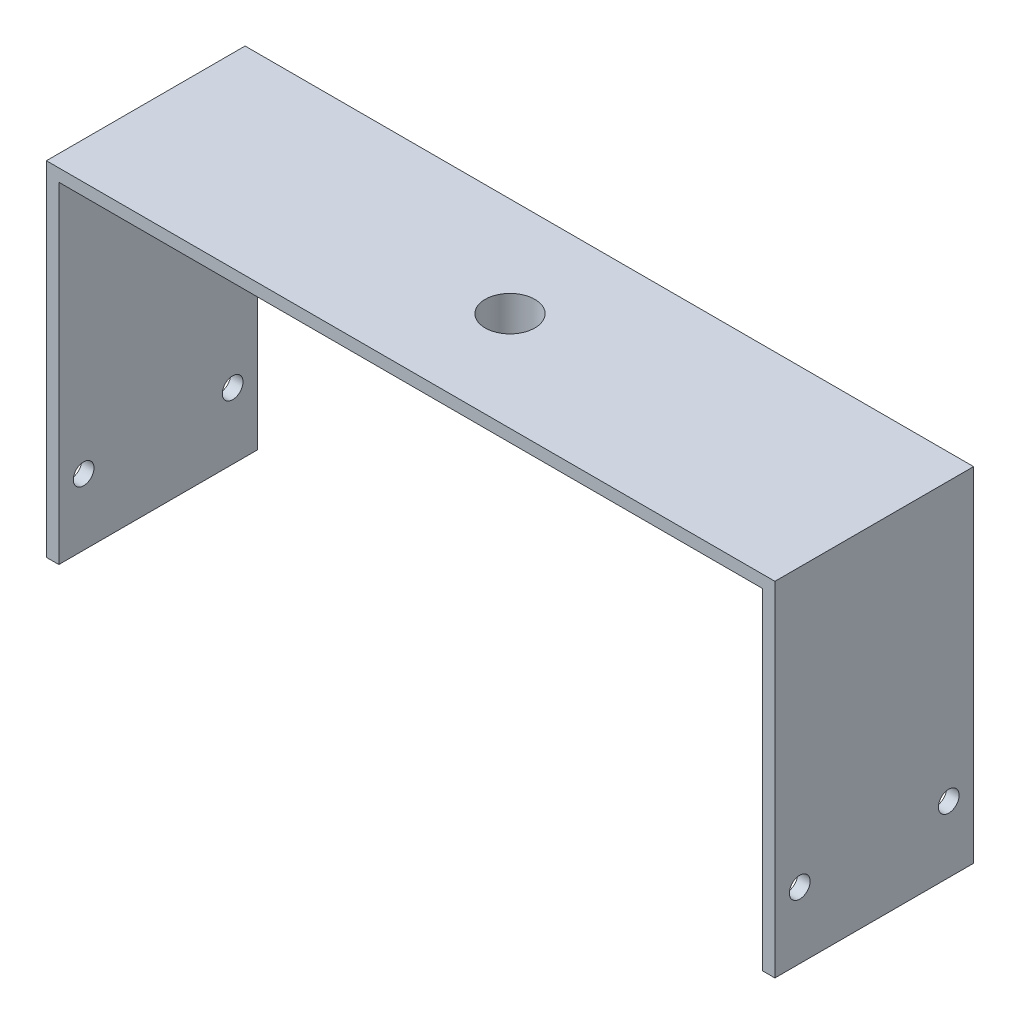
ISO-10303-21;
HEADER;
FILE_DESCRIPTION(('STEP AP214'),'2;1');
FILE_NAME('part.step','',(''),(''),'','','');
FILE_SCHEMA(('AUTOMOTIVE_DESIGN { 1 0 10303 214 1 1 1 1 }'));
ENDSEC;
DATA;
#1=APPLICATION_CONTEXT('core data for automotive mechanical design processes');
#2=APPLICATION_PROTOCOL_DEFINITION('international standard','automotive_design',2000,#1);
#3=PRODUCT_CONTEXT('',#1,'mechanical');
#4=PRODUCT('Part','Part','',(#3));
#5=PRODUCT_RELATED_PRODUCT_CATEGORY('part','',(#4));
#6=PRODUCT_DEFINITION_FORMATION('','',#4);
#7=PRODUCT_DEFINITION_CONTEXT('part definition',#1,'design');
#8=PRODUCT_DEFINITION('design','',#6,#7);
#9=PRODUCT_DEFINITION_SHAPE('','',#8);
#10=(LENGTH_UNIT() NAMED_UNIT(*) SI_UNIT(.MILLI.,.METRE.));
#11=(NAMED_UNIT(*) PLANE_ANGLE_UNIT() SI_UNIT($,.RADIAN.));
#12=(NAMED_UNIT(*) SI_UNIT($,.STERADIAN.) SOLID_ANGLE_UNIT());
#13=UNCERTAINTY_MEASURE_WITH_UNIT(LENGTH_MEASURE(1.E-05),#10,'distance_accuracy_value','');
#14=(GEOMETRIC_REPRESENTATION_CONTEXT(3) GLOBAL_UNCERTAINTY_ASSIGNED_CONTEXT((#13)) GLOBAL_UNIT_ASSIGNED_CONTEXT((#10,
#11,#12)) REPRESENTATION_CONTEXT('',''));
#15=CARTESIAN_POINT('',(0.,0.,0.));
#16=DIRECTION('',(0.,0.,1.));
#17=DIRECTION('',(1.,0.,0.));
#18=AXIS2_PLACEMENT_3D('',#15,#16,#17);
#19=CARTESIAN_POINT('',(64.1282151360602,9.59215638123489,24.));
#20=DIRECTION('',(0.,1.,0.));
#21=DIRECTION('',(-1.,0.,0.));
#22=AXIS2_PLACEMENT_3D('',#19,#20,#21);
#23=PLANE('',#22);
#24=DIRECTION('',(1.,0.,0.));
#25=VECTOR('',#24,1.);
#26=CARTESIAN_POINT('',(64.1282151360602,9.59215638123489,0.));
#27=LINE('',#26,#25);
#28=CARTESIAN_POINT('',(-20.8717848639398,9.59215638123487,0.));
#29=VERTEX_POINT('',#28);
#30=CARTESIAN_POINT('',(64.1282151360602,9.59215638123489,0.));
#31=VERTEX_POINT('',#30);
#32=EDGE_CURVE('E211',#29,#31,#27,.T.);
#33=ORIENTED_EDGE('',*,*,#32,.T.);
#34=DIRECTION('',(0.,0.,-1.));
#35=VECTOR('',#34,1.);
#36=CARTESIAN_POINT('',(64.1282151360602,9.59215638123489,24.));
#37=LINE('',#36,#35);
#38=CARTESIAN_POINT('',(64.1282151360602,9.59215638123489,24.));
#39=VERTEX_POINT('',#38);
#40=EDGE_CURVE('E231',#39,#31,#37,.T.);
#41=ORIENTED_EDGE('',*,*,#40,.F.);
#42=DIRECTION('',(1.,0.,0.));
#43=VECTOR('',#42,1.);
#44=CARTESIAN_POINT('',(64.1282151360602,9.59215638123489,24.));
#45=LINE('',#44,#43);
#46=CARTESIAN_POINT('',(-20.8717848639398,9.59215638123487,24.));
#47=VERTEX_POINT('',#46);
#48=EDGE_CURVE('E194',#47,#39,#45,.T.);
#49=ORIENTED_EDGE('',*,*,#48,.F.);
#50=DIRECTION('',(0.,0.,-1.));
#51=VECTOR('',#50,1.);
#52=CARTESIAN_POINT('',(-20.8717848639398,9.59215638123487,24.));
#53=LINE('',#52,#51);
#54=EDGE_CURVE('E234',#47,#29,#53,.T.);
#55=ORIENTED_EDGE('',*,*,#54,.T.);
#56=EDGE_LOOP('',(#33,#41,#49,#55));
#57=FACE_BOUND('',#56,.T.);
#58=DIRECTION('',(0.5,0.,-0.866025403784439));
#59=VECTOR('',#58,1.);
#60=CARTESIAN_POINT('',(15.6282151360602,9.59215638123488,12.));
#61=LINE('',#60,#59);
#62=CARTESIAN_POINT('',(15.6282151360602,9.59215638123488,12.));
#63=VERTEX_POINT('',#62);
#64=CARTESIAN_POINT('',(18.6282151360602,9.59215638123488,6.80384757729337));
#65=VERTEX_POINT('',#64);
#66=EDGE_CURVE('E157',#63,#65,#61,.T.);
#67=ORIENTED_EDGE('',*,*,#66,.F.);
#68=DIRECTION('',(-0.5,0.,-0.866025403784438));
#69=VECTOR('',#68,1.);
#70=CARTESIAN_POINT('',(18.6282151360602,9.59215638123488,17.1961524227066));
#71=LINE('',#70,#69);
#72=CARTESIAN_POINT('',(18.6282151360602,9.59215638123488,17.1961524227066));
#73=VERTEX_POINT('',#72);
#74=EDGE_CURVE('E154',#73,#63,#71,.T.);
#75=ORIENTED_EDGE('',*,*,#74,.F.);
#76=DIRECTION('',(-1.,0.,0.));
#77=VECTOR('',#76,1.);
#78=CARTESIAN_POINT('',(24.6282151360602,9.59215638123488,17.1961524227066));
#79=LINE('',#78,#77);
#80=CARTESIAN_POINT('',(24.6282151360602,9.59215638123488,17.1961524227066));
#81=VERTEX_POINT('',#80);
#82=EDGE_CURVE('E498',#81,#73,#79,.T.);
#83=ORIENTED_EDGE('',*,*,#82,.F.);
#84=DIRECTION('',(-0.5,0.,0.866025403784439));
#85=VECTOR('',#84,1.);
#86=CARTESIAN_POINT('',(27.6282151360602,9.59215638123488,12.));
#87=LINE('',#86,#85);
#88=CARTESIAN_POINT('',(27.6282151360602,9.59215638123488,12.));
#89=VERTEX_POINT('',#88);
#90=EDGE_CURVE('E513',#89,#81,#87,.T.);
#91=ORIENTED_EDGE('',*,*,#90,.F.);
#92=DIRECTION('',(0.5,0.,0.866025403784439));
#93=VECTOR('',#92,1.);
#94=CARTESIAN_POINT('',(24.6282151360602,9.59215638123488,6.80384757729337));
#95=LINE('',#94,#93);
#96=CARTESIAN_POINT('',(24.6282151360602,9.59215638123488,6.80384757729337));
#97=VERTEX_POINT('',#96);
#98=EDGE_CURVE('E55',#97,#89,#95,.T.);
#99=ORIENTED_EDGE('',*,*,#98,.F.);
#100=DIRECTION('',(1.,0.,0.));
#101=VECTOR('',#100,1.);
#102=CARTESIAN_POINT('',(18.6282151360602,9.59215638123488,6.80384757729337));
#103=LINE('',#102,#101);
#104=EDGE_CURVE('E50',#65,#97,#103,.T.);
#105=ORIENTED_EDGE('',*,*,#104,.F.);
#106=EDGE_LOOP('',(#67,#75,#83,#91,#99,#105));
#107=FACE_BOUND('',#106,.T.);
#108=ADVANCED_FACE('F33',(#57,#107),#23,.F.);
#109=CARTESIAN_POINT('',(-22.3717848639398,-30.4078436187651,24.));
#110=DIRECTION('',(1.,0.,0.));
#111=DIRECTION('',(0.,0.,-1.));
#112=AXIS2_PLACEMENT_3D('',#109,#110,#111);
#113=PLANE('',#112);
#114=CARTESIAN_POINT('',(-22.3717848639398,-22.4078436187651,3.));
#115=DIRECTION('',(-1.,0.,0.));
#116=DIRECTION('',(0.,0.,1.));
#117=AXIS2_PLACEMENT_3D('',#114,#115,#116);
#118=CIRCLE('',#117,1.25);
#119=CARTESIAN_POINT('',(-22.3717848639397,-22.4078436187651,4.25));
#120=VERTEX_POINT('',#119);
#121=EDGE_CURVE('E167',#120,#120,#118,.T.);
#122=ORIENTED_EDGE('',*,*,#121,.F.);
#123=EDGE_LOOP('',(#122));
#124=FACE_BOUND('',#123,.T.);
#125=CARTESIAN_POINT('',(-22.3717848639398,-22.4078436187651,21.));
#126=DIRECTION('',(-1.,0.,0.));
#127=DIRECTION('',(0.,0.,-1.));
#128=AXIS2_PLACEMENT_3D('',#125,#126,#127);
#129=CIRCLE('',#128,1.25);
#130=CARTESIAN_POINT('',(-22.3717848639397,-22.4078436187651,22.25));
#131=VERTEX_POINT('',#130);
#132=EDGE_CURVE('E161',#131,#131,#129,.T.);
#133=ORIENTED_EDGE('',*,*,#132,.F.);
#134=EDGE_LOOP('',(#133));
#135=FACE_BOUND('',#134,.T.);
#136=DIRECTION('',(0.,-1.,0.));
#137=VECTOR('',#136,1.);
#138=CARTESIAN_POINT('',(-22.3717848639398,-30.4078436187651,0.));
#139=LINE('',#138,#137);
#140=CARTESIAN_POINT('',(-22.3717848639398,11.0921563812349,0.));
#141=VERTEX_POINT('',#140);
#142=CARTESIAN_POINT('',(-22.3717848639398,-30.4078436187651,0.));
#143=VERTEX_POINT('',#142);
#144=EDGE_CURVE('E185',#141,#143,#139,.T.);
#145=ORIENTED_EDGE('',*,*,#144,.T.);
#146=DIRECTION('',(0.,0.,-1.));
#147=VECTOR('',#146,1.);
#148=CARTESIAN_POINT('',(-22.3717848639398,-30.4078436187651,24.));
#149=LINE('',#148,#147);
#150=CARTESIAN_POINT('',(-22.3717848639398,-30.4078436187651,24.));
#151=VERTEX_POINT('',#150);
#152=EDGE_CURVE('E11',#151,#143,#149,.T.);
#153=ORIENTED_EDGE('',*,*,#152,.F.);
#154=DIRECTION('',(0.,-1.,0.));
#155=VECTOR('',#154,1.);
#156=CARTESIAN_POINT('',(-22.3717848639398,-30.4078436187651,24.));
#157=LINE('',#156,#155);
#158=CARTESIAN_POINT('',(-22.3717848639398,11.0921563812349,24.));
#159=VERTEX_POINT('',#158);
#160=EDGE_CURVE('E186',#159,#151,#157,.T.);
#161=ORIENTED_EDGE('',*,*,#160,.F.);
#162=DIRECTION('',(0.,0.,-1.));
#163=VECTOR('',#162,1.);
#164=CARTESIAN_POINT('',(-22.3717848639398,11.0921563812349,24.));
#165=LINE('',#164,#163);
#166=EDGE_CURVE('E204',#159,#141,#165,.T.);
#167=ORIENTED_EDGE('',*,*,#166,.T.);
#168=EDGE_LOOP('',(#145,#153,#161,#167));
#169=FACE_BOUND('',#168,.T.);
#170=ADVANCED_FACE('F35',(#124,#135,#169),#113,.F.);
#171=CARTESIAN_POINT('',(-22.3717848639398,-30.4078436187651,24.));
#172=DIRECTION('',(0.,1.,0.));
#173=DIRECTION('',(0.,0.,1.));
#174=AXIS2_PLACEMENT_3D('',#171,#172,#173);
#175=PLANE('',#174);
#176=DIRECTION('',(1.,0.,0.));
#177=VECTOR('',#176,1.);
#178=CARTESIAN_POINT('',(-22.3717848639398,-30.4078436187651,0.));
#179=LINE('',#178,#177);
#180=CARTESIAN_POINT('',(-20.8717848639398,-30.4078436187651,0.));
#181=VERTEX_POINT('',#180);
#182=EDGE_CURVE('E207',#143,#181,#179,.T.);
#183=ORIENTED_EDGE('',*,*,#182,.T.);
#184=DIRECTION('',(0.,0.,-1.));
#185=VECTOR('',#184,1.);
#186=CARTESIAN_POINT('',(-20.8717848639398,-30.4078436187651,24.));
#187=LINE('',#186,#185);
#188=CARTESIAN_POINT('',(-20.8717848639398,-30.4078436187651,24.));
#189=VERTEX_POINT('',#188);
#190=EDGE_CURVE('E42',#189,#181,#187,.T.);
#191=ORIENTED_EDGE('',*,*,#190,.F.);
#192=DIRECTION('',(1.,0.,0.));
#193=VECTOR('',#192,1.);
#194=CARTESIAN_POINT('',(-22.3717848639398,-30.4078436187651,24.));
#195=LINE('',#194,#193);
#196=EDGE_CURVE('E189',#151,#189,#195,.T.);
#197=ORIENTED_EDGE('',*,*,#196,.F.);
#198=ORIENTED_EDGE('',*,*,#152,.T.);
#199=EDGE_LOOP('',(#183,#191,#197,#198));
#200=FACE_BOUND('',#199,.T.);
#201=ADVANCED_FACE('F291',(#200),#175,.F.);
#202=CARTESIAN_POINT('',(-20.8717848639398,-30.4078436187651,24.));
#203=DIRECTION('',(-1.,0.,0.));
#204=DIRECTION('',(0.,-1.,0.));
#205=AXIS2_PLACEMENT_3D('',#202,#203,#204);
#206=PLANE('',#205);
#207=CARTESIAN_POINT('',(-20.8717848639398,-22.4078436187651,3.));
#208=DIRECTION('',(-1.,0.,0.));
#209=DIRECTION('',(0.,-1.,0.));
#210=AXIS2_PLACEMENT_3D('',#207,#208,#209);
#211=CIRCLE('',#210,1.25);
#212=CARTESIAN_POINT('',(-20.8717848639397,-22.4078436187651,4.25));
#213=VERTEX_POINT('',#212);
#214=EDGE_CURVE('E182',#213,#213,#211,.T.);
#215=ORIENTED_EDGE('',*,*,#214,.T.);
#216=EDGE_LOOP('',(#215));
#217=FACE_BOUND('',#216,.T.);
#218=CARTESIAN_POINT('',(-20.8717848639398,-22.4078436187651,21.));
#219=DIRECTION('',(-1.,0.,0.));
#220=DIRECTION('',(0.,-1.,0.));
#221=AXIS2_PLACEMENT_3D('',#218,#219,#220);
#222=CIRCLE('',#221,1.25);
#223=CARTESIAN_POINT('',(-20.8717848639397,-22.4078436187651,22.25));
#224=VERTEX_POINT('',#223);
#225=EDGE_CURVE('E176',#224,#224,#222,.T.);
#226=ORIENTED_EDGE('',*,*,#225,.T.);
#227=EDGE_LOOP('',(#226));
#228=FACE_BOUND('',#227,.T.);
#229=DIRECTION('',(0.,1.,0.));
#230=VECTOR('',#229,1.);
#231=CARTESIAN_POINT('',(-20.8717848639398,-30.4078436187651,0.));
#232=LINE('',#231,#230);
#233=EDGE_CURVE('E209',#181,#29,#232,.T.);
#234=ORIENTED_EDGE('',*,*,#233,.T.);
#235=ORIENTED_EDGE('',*,*,#54,.F.);
#236=DIRECTION('',(0.,1.,0.));
#237=VECTOR('',#236,1.);
#238=CARTESIAN_POINT('',(-20.8717848639398,-30.4078436187651,24.));
#239=LINE('',#238,#237);
#240=EDGE_CURVE('E192',#189,#47,#239,.T.);
#241=ORIENTED_EDGE('',*,*,#240,.F.);
#242=ORIENTED_EDGE('',*,*,#190,.T.);
#243=EDGE_LOOP('',(#234,#235,#241,#242));
#244=FACE_BOUND('',#243,.T.);
#245=ADVANCED_FACE('F257',(#217,#228,#244),#206,.F.);
#246=CARTESIAN_POINT('',(64.1282151360602,-30.4078436187651,24.));
#247=DIRECTION('',(1.,0.,0.));
#248=DIRECTION('',(0.,0.,-1.));
#249=AXIS2_PLACEMENT_3D('',#246,#247,#248);
#250=PLANE('',#249);
#251=CARTESIAN_POINT('',(64.1282151360602,-22.4078436187651,3.));
#252=DIRECTION('',(1.,0.,0.));
#253=DIRECTION('',(0.,0.,-1.));
#254=AXIS2_PLACEMENT_3D('',#251,#252,#253);
#255=CIRCLE('',#254,1.25);
#256=CARTESIAN_POINT('',(64.1282151360602,-22.4078436187651,4.25));
#257=VERTEX_POINT('',#256);
#258=EDGE_CURVE('E179',#257,#257,#255,.T.);
#259=ORIENTED_EDGE('',*,*,#258,.T.);
#260=EDGE_LOOP('',(#259));
#261=FACE_BOUND('',#260,.T.);
#262=CARTESIAN_POINT('',(64.1282151360602,-22.4078436187651,21.));
#263=DIRECTION('',(1.,0.,0.));
#264=DIRECTION('',(0.,0.,-1.));
#265=AXIS2_PLACEMENT_3D('',#262,#263,#264);
#266=CIRCLE('',#265,1.25);
#267=CARTESIAN_POINT('',(64.1282151360602,-22.4078436187651,22.25));
#268=VERTEX_POINT('',#267);
#269=EDGE_CURVE('E173',#268,#268,#266,.T.);
#270=ORIENTED_EDGE('',*,*,#269,.T.);
#271=EDGE_LOOP('',(#270));
#272=FACE_BOUND('',#271,.T.);
#273=DIRECTION('',(0.,-1.,0.));
#274=VECTOR('',#273,1.);
#275=CARTESIAN_POINT('',(64.1282151360602,-30.4078436187651,0.));
#276=LINE('',#275,#274);
#277=CARTESIAN_POINT('',(64.1282151360602,-30.4078436187651,0.));
#278=VERTEX_POINT('',#277);
#279=EDGE_CURVE('E213',#31,#278,#276,.T.);
#280=ORIENTED_EDGE('',*,*,#279,.T.);
#281=DIRECTION('',(0.,0.,-1.));
#282=VECTOR('',#281,1.);
#283=CARTESIAN_POINT('',(64.1282151360602,-30.4078436187651,24.));
#284=LINE('',#283,#282);
#285=CARTESIAN_POINT('',(64.1282151360602,-30.4078436187651,24.));
#286=VERTEX_POINT('',#285);
#287=EDGE_CURVE('E228',#286,#278,#284,.T.);
#288=ORIENTED_EDGE('',*,*,#287,.F.);
#289=DIRECTION('',(0.,-1.,0.));
#290=VECTOR('',#289,1.);
#291=CARTESIAN_POINT('',(64.1282151360602,-30.4078436187651,24.));
#292=LINE('',#291,#290);
#293=EDGE_CURVE('E196',#39,#286,#292,.T.);
#294=ORIENTED_EDGE('',*,*,#293,.F.);
#295=ORIENTED_EDGE('',*,*,#40,.T.);
#296=EDGE_LOOP('',(#280,#288,#294,#295));
#297=FACE_BOUND('',#296,.T.);
#298=ADVANCED_FACE('F253',(#261,#272,#297),#250,.F.);
#299=CARTESIAN_POINT('',(64.1282151360602,-30.4078436187651,24.));
#300=DIRECTION('',(0.,1.,0.));
#301=DIRECTION('',(0.,0.,1.));
#302=AXIS2_PLACEMENT_3D('',#299,#300,#301);
#303=PLANE('',#302);
#304=DIRECTION('',(1.,0.,0.));
#305=VECTOR('',#304,1.);
#306=CARTESIAN_POINT('',(64.1282151360602,-30.4078436187651,0.));
#307=LINE('',#306,#305);
#308=CARTESIAN_POINT('',(65.6282151360602,-30.4078436187651,0.));
#309=VERTEX_POINT('',#308);
#310=EDGE_CURVE('E215',#278,#309,#307,.T.);
#311=ORIENTED_EDGE('',*,*,#310,.T.);
#312=DIRECTION('',(0.,0.,-1.));
#313=VECTOR('',#312,1.);
#314=CARTESIAN_POINT('',(65.6282151360602,-30.4078436187651,24.));
#315=LINE('',#314,#313);
#316=CARTESIAN_POINT('',(65.6282151360602,-30.4078436187651,24.));
#317=VERTEX_POINT('',#316);
#318=EDGE_CURVE('E225',#317,#309,#315,.T.);
#319=ORIENTED_EDGE('',*,*,#318,.F.);
#320=DIRECTION('',(1.,0.,0.));
#321=VECTOR('',#320,1.);
#322=CARTESIAN_POINT('',(64.1282151360602,-30.4078436187651,24.));
#323=LINE('',#322,#321);
#324=EDGE_CURVE('E198',#286,#317,#323,.T.);
#325=ORIENTED_EDGE('',*,*,#324,.F.);
#326=ORIENTED_EDGE('',*,*,#287,.T.);
#327=EDGE_LOOP('',(#311,#319,#325,#326));
#328=FACE_BOUND('',#327,.T.);
#329=ADVANCED_FACE('F256',(#328),#303,.F.);
#330=CARTESIAN_POINT('',(65.6282151360602,-30.4078436187651,24.));
#331=DIRECTION('',(-1.,0.,0.));
#332=DIRECTION('',(0.,0.,1.));
#333=AXIS2_PLACEMENT_3D('',#330,#331,#332);
#334=PLANE('',#333);
#335=CARTESIAN_POINT('',(65.6282151360602,-22.4078436187651,3.));
#336=DIRECTION('',(-1.,0.,0.));
#337=DIRECTION('',(0.,0.,1.));
#338=AXIS2_PLACEMENT_3D('',#335,#336,#337);
#339=CIRCLE('',#338,1.25);
#340=CARTESIAN_POINT('',(65.6282151360602,-22.4078436187651,4.25));
#341=VERTEX_POINT('',#340);
#342=EDGE_CURVE('E37',#341,#341,#339,.T.);
#343=ORIENTED_EDGE('',*,*,#342,.T.);
#344=EDGE_LOOP('',(#343));
#345=FACE_BOUND('',#344,.T.);
#346=CARTESIAN_POINT('',(65.6282151360602,-22.4078436187651,21.));
#347=DIRECTION('',(-1.,0.,0.));
#348=DIRECTION('',(0.,0.,1.));
#349=AXIS2_PLACEMENT_3D('',#346,#347,#348);
#350=CIRCLE('',#349,1.25);
#351=CARTESIAN_POINT('',(65.6282151360602,-22.4078436187651,22.25));
#352=VERTEX_POINT('',#351);
#353=EDGE_CURVE('E170',#352,#352,#350,.T.);
#354=ORIENTED_EDGE('',*,*,#353,.T.);
#355=EDGE_LOOP('',(#354));
#356=FACE_BOUND('',#355,.T.);
#357=DIRECTION('',(0.,1.,0.));
#358=VECTOR('',#357,1.);
#359=CARTESIAN_POINT('',(65.6282151360602,-30.4078436187651,0.));
#360=LINE('',#359,#358);
#361=CARTESIAN_POINT('',(65.6282151360602,11.0921563812349,0.));
#362=VERTEX_POINT('',#361);
#363=EDGE_CURVE('E217',#309,#362,#360,.T.);
#364=ORIENTED_EDGE('',*,*,#363,.T.);
#365=DIRECTION('',(0.,0.,-1.));
#366=VECTOR('',#365,1.);
#367=CARTESIAN_POINT('',(65.6282151360602,11.0921563812349,24.));
#368=LINE('',#367,#366);
#369=CARTESIAN_POINT('',(65.6282151360602,11.0921563812349,24.));
#370=VERTEX_POINT('',#369);
#371=EDGE_CURVE('E222',#370,#362,#368,.T.);
#372=ORIENTED_EDGE('',*,*,#371,.F.);
#373=DIRECTION('',(0.,1.,0.));
#374=VECTOR('',#373,1.);
#375=CARTESIAN_POINT('',(65.6282151360602,-30.4078436187651,24.));
#376=LINE('',#375,#374);
#377=EDGE_CURVE('E200',#317,#370,#376,.T.);
#378=ORIENTED_EDGE('',*,*,#377,.F.);
#379=ORIENTED_EDGE('',*,*,#318,.T.);
#380=EDGE_LOOP('',(#364,#372,#378,#379));
#381=FACE_BOUND('',#380,.T.);
#382=ADVANCED_FACE('F241',(#345,#356,#381),#334,.F.);
#383=CARTESIAN_POINT('',(65.6282151360602,11.0921563812349,24.));
#384=DIRECTION('',(0.,-1.,0.));
#385=DIRECTION('',(1.,0.,0.));
#386=AXIS2_PLACEMENT_3D('',#383,#384,#385);
#387=PLANE('',#386);
#388=CARTESIAN_POINT('',(21.6282151360602,11.0921563812349,12.));
#389=DIRECTION('',(0.,1.,0.));
#390=DIRECTION('',(-1.,0.,0.));
#391=AXIS2_PLACEMENT_3D('',#388,#389,#390);
#392=CIRCLE('',#391,3.);
#393=CARTESIAN_POINT('',(18.6282151360602,11.0921563812349,12.));
#394=VERTEX_POINT('',#393);
#395=EDGE_CURVE('E158',#394,#394,#392,.T.);
#396=ORIENTED_EDGE('',*,*,#395,.F.);
#397=EDGE_LOOP('',(#396));
#398=FACE_BOUND('',#397,.T.);
#399=DIRECTION('',(-1.,0.,0.));
#400=VECTOR('',#399,1.);
#401=CARTESIAN_POINT('',(65.6282151360602,11.0921563812349,0.));
#402=LINE('',#401,#400);
#403=EDGE_CURVE('E190',#362,#141,#402,.T.);
#404=ORIENTED_EDGE('',*,*,#403,.T.);
#405=ORIENTED_EDGE('',*,*,#166,.F.);
#406=DIRECTION('',(-1.,0.,0.));
#407=VECTOR('',#406,1.);
#408=CARTESIAN_POINT('',(65.6282151360602,11.0921563812349,24.));
#409=LINE('',#408,#407);
#410=EDGE_CURVE('E202',#370,#159,#409,.T.);
#411=ORIENTED_EDGE('',*,*,#410,.F.);
#412=ORIENTED_EDGE('',*,*,#371,.T.);
#413=EDGE_LOOP('',(#404,#405,#411,#412));
#414=FACE_BOUND('',#413,.T.);
#415=ADVANCED_FACE('F277',(#398,#414),#387,.F.);
#416=CARTESIAN_POINT('',(0.,0.,24.));
#417=DIRECTION('',(0.,0.,1.));
#418=DIRECTION('',(1.,0.,0.));
#419=AXIS2_PLACEMENT_3D('',#416,#417,#418);
#420=PLANE('',#419);
#421=ORIENTED_EDGE('',*,*,#160,.T.);
#422=ORIENTED_EDGE('',*,*,#196,.T.);
#423=ORIENTED_EDGE('',*,*,#240,.T.);
#424=ORIENTED_EDGE('',*,*,#48,.T.);
#425=ORIENTED_EDGE('',*,*,#293,.T.);
#426=ORIENTED_EDGE('',*,*,#324,.T.);
#427=ORIENTED_EDGE('',*,*,#377,.T.);
#428=ORIENTED_EDGE('',*,*,#410,.T.);
#429=EDGE_LOOP('',(#421,#422,#423,#424,#425,#426,#427,#428));
#430=FACE_BOUND('',#429,.T.);
#431=ADVANCED_FACE('F281',(#430),#420,.T.);
#432=CARTESIAN_POINT('',(0.,0.,0.));
#433=DIRECTION('',(0.,0.,1.));
#434=DIRECTION('',(1.,0.,0.));
#435=AXIS2_PLACEMENT_3D('',#432,#433,#434);
#436=PLANE('',#435);
#437=ORIENTED_EDGE('',*,*,#144,.F.);
#438=ORIENTED_EDGE('',*,*,#403,.F.);
#439=ORIENTED_EDGE('',*,*,#363,.F.);
#440=ORIENTED_EDGE('',*,*,#310,.F.);
#441=ORIENTED_EDGE('',*,*,#279,.F.);
#442=ORIENTED_EDGE('',*,*,#32,.F.);
#443=ORIENTED_EDGE('',*,*,#233,.F.);
#444=ORIENTED_EDGE('',*,*,#182,.F.);
#445=EDGE_LOOP('',(#437,#438,#439,#440,#441,#442,#443,#444));
#446=FACE_BOUND('',#445,.T.);
#447=ADVANCED_FACE('F248',(#446),#436,.F.);
#448=CARTESIAN_POINT('',(67.6282151360602,-22.4078436187651,21.));
#449=DIRECTION('',(-1.,0.,0.));
#450=DIRECTION('',(0.,0.,1.));
#451=AXIS2_PLACEMENT_3D('',#448,#449,#450);
#452=CYLINDRICAL_SURFACE('',#451,1.25);
#453=CARTESIAN_POINT('',(65.6282151360602,-22.4078436187651,22.25));
#454=CARTESIAN_POINT('',(65.6125901360602,-22.4078436187651,22.25));
#455=CARTESIAN_POINT('',(65.5969651360602,-22.4078436187651,22.25));
#456=CARTESIAN_POINT('',(65.5657151360602,-22.4078436187651,22.25));
#457=CARTESIAN_POINT('',(65.5500901360602,-22.4078436187651,22.25));
#458=CARTESIAN_POINT('',(65.5188401360602,-22.4078436187651,22.25));
#459=CARTESIAN_POINT('',(65.5032151360602,-22.4078436187651,22.25));
#460=CARTESIAN_POINT('',(65.4719651360602,-22.4078436187651,22.25));
#461=CARTESIAN_POINT('',(65.4563401360602,-22.4078436187651,22.25));
#462=CARTESIAN_POINT('',(65.4250901360602,-22.4078436187651,22.25));
#463=CARTESIAN_POINT('',(65.4094651360602,-22.4078436187651,22.25));
#464=CARTESIAN_POINT('',(65.3782151360602,-22.4078436187651,22.25));
#465=CARTESIAN_POINT('',(65.3625901360602,-22.4078436187651,22.25));
#466=CARTESIAN_POINT('',(65.3313401360602,-22.4078436187651,22.25));
#467=CARTESIAN_POINT('',(65.3157151360602,-22.4078436187651,22.25));
#468=CARTESIAN_POINT('',(65.2844651360602,-22.4078436187651,22.25));
#469=CARTESIAN_POINT('',(65.2688401360602,-22.4078436187651,22.25));
#470=CARTESIAN_POINT('',(65.2375901360602,-22.4078436187651,22.25));
#471=CARTESIAN_POINT('',(65.2219651360602,-22.4078436187651,22.25));
#472=CARTESIAN_POINT('',(65.1907151360602,-22.4078436187651,22.25));
#473=CARTESIAN_POINT('',(65.1750901360602,-22.4078436187651,22.25));
#474=CARTESIAN_POINT('',(65.1438401360602,-22.4078436187651,22.25));
#475=CARTESIAN_POINT('',(65.1282151360602,-22.4078436187651,22.25));
#476=CARTESIAN_POINT('',(65.0969651360602,-22.4078436187651,22.25));
#477=CARTESIAN_POINT('',(65.0813401360602,-22.4078436187651,22.25));
#478=CARTESIAN_POINT('',(65.0500901360602,-22.4078436187651,22.25));
#479=CARTESIAN_POINT('',(65.0344651360602,-22.4078436187651,22.25));
#480=CARTESIAN_POINT('',(65.0032151360602,-22.4078436187651,22.25));
#481=CARTESIAN_POINT('',(64.9875901360602,-22.4078436187651,22.25));
#482=CARTESIAN_POINT('',(64.9563401360602,-22.4078436187651,22.25));
#483=CARTESIAN_POINT('',(64.9407151360602,-22.4078436187651,22.25));
#484=CARTESIAN_POINT('',(64.9094651360602,-22.4078436187651,22.25));
#485=CARTESIAN_POINT('',(64.8938401360602,-22.4078436187651,22.25));
#486=CARTESIAN_POINT('',(64.8625901360602,-22.4078436187651,22.25));
#487=CARTESIAN_POINT('',(64.8469651360602,-22.4078436187651,22.25));
#488=CARTESIAN_POINT('',(64.8157151360602,-22.4078436187651,22.25));
#489=CARTESIAN_POINT('',(64.8000901360602,-22.4078436187651,22.25));
#490=CARTESIAN_POINT('',(64.7688401360602,-22.4078436187651,22.25));
#491=CARTESIAN_POINT('',(64.7532151360602,-22.4078436187651,22.25));
#492=CARTESIAN_POINT('',(64.7219651360602,-22.4078436187651,22.25));
#493=CARTESIAN_POINT('',(64.7063401360602,-22.4078436187651,22.25));
#494=CARTESIAN_POINT('',(64.6750901360602,-22.4078436187651,22.25));
#495=CARTESIAN_POINT('',(64.6594651360602,-22.4078436187651,22.25));
#496=CARTESIAN_POINT('',(64.6282151360602,-22.4078436187651,22.25));
#497=CARTESIAN_POINT('',(64.6125901360602,-22.4078436187651,22.25));
#498=CARTESIAN_POINT('',(64.5813401360602,-22.4078436187651,22.25));
#499=CARTESIAN_POINT('',(64.5657151360602,-22.4078436187651,22.25));
#500=CARTESIAN_POINT('',(64.5344651360602,-22.4078436187651,22.25));
#501=CARTESIAN_POINT('',(64.5188401360602,-22.4078436187651,22.25));
#502=CARTESIAN_POINT('',(64.4875901360602,-22.4078436187651,22.25));
#503=CARTESIAN_POINT('',(64.4719651360602,-22.4078436187651,22.25));
#504=CARTESIAN_POINT('',(64.4407151360602,-22.4078436187651,22.25));
#505=CARTESIAN_POINT('',(64.4250901360602,-22.4078436187651,22.25));
#506=CARTESIAN_POINT('',(64.3938401360602,-22.4078436187651,22.25));
#507=CARTESIAN_POINT('',(64.3782151360602,-22.4078436187651,22.25));
#508=CARTESIAN_POINT('',(64.3469651360602,-22.4078436187651,22.25));
#509=CARTESIAN_POINT('',(64.3313401360602,-22.4078436187651,22.25));
#510=CARTESIAN_POINT('',(64.3000901360602,-22.4078436187651,22.25));
#511=CARTESIAN_POINT('',(64.2844651360602,-22.4078436187651,22.25));
#512=CARTESIAN_POINT('',(64.2532151360602,-22.4078436187651,22.25));
#513=CARTESIAN_POINT('',(64.2375901360602,-22.4078436187651,22.25));
#514=CARTESIAN_POINT('',(64.2063401360602,-22.4078436187651,22.25));
#515=CARTESIAN_POINT('',(64.1907151360602,-22.4078436187651,22.25));
#516=CARTESIAN_POINT('',(64.1594651360602,-22.4078436187651,22.25));
#517=CARTESIAN_POINT('',(64.1438401360602,-22.4078436187651,22.25));
#518=CARTESIAN_POINT('',(64.1282151360602,-22.4078436187651,22.25));
#519=B_SPLINE_CURVE_WITH_KNOTS('',3,(#453,#454,#455,#456,#457,#458,#459,#460,#461,#462,#463,
#464,#465,#466,#467,#468,#469,#470,#471,#472,#473,#474,#475,#476,#477,#478,#479,#480,#481,#482,
#483,#484,#485,#486,#487,#488,#489,#490,#491,#492,#493,#494,#495,#496,#497,#498,#499,#500,#501,
#502,#503,#504,#505,#506,#507,#508,#509,#510,#511,#512,#513,#514,#515,#516,#517,#518),
.UNSPECIFIED.,.F.,.F.,(4,2,2,2,2,2,2,2,2,2,2,2,2,2,2,2,2,2,2,2,2,2,2,2,2,2,2,2,2,2,2,2,4),(0.,
0.0468750000000018,0.0937500000000036,0.140625000000005,0.187500000000007,0.234375000000009,
0.281250000000011,0.328125000000012,0.375,0.421875000000002,0.468750000000004,0.515625000000006,
0.562500000000007,0.609375000000009,0.656250000000011,0.703125000000013,0.750000000000001,
0.796875000000002,0.843750000000004,0.890625000000006,0.937500000000008,0.98437500000001,
1.03125000000001,1.07812500000001,1.125,1.171875,1.21875,1.26562500000001,1.31250000000001,
1.35937500000001,1.40625000000001,1.45312500000001,1.5),.UNSPECIFIED.);
#520=EDGE_CURVE('BSEAM244',#352,#268,#519,.T.);
#521=ORIENTED_EDGE('',*,*,#353,.F.);
#522=ORIENTED_EDGE('',*,*,#269,.F.);
#523=ORIENTED_EDGE('',*,*,#520,.T.);
#524=ORIENTED_EDGE('',*,*,#520,.F.);
#525=EDGE_LOOP('',(#521,#523,#522,#524));
#526=FACE_BOUND('',#525,.T.);
#527=ADVANCED_FACE('F244',(#526),#452,.F.);
#528=CARTESIAN_POINT('',(67.6282151360602,-22.4078436187651,3.));
#529=DIRECTION('',(-1.,0.,0.));
#530=DIRECTION('',(0.,0.,1.));
#531=AXIS2_PLACEMENT_3D('',#528,#529,#530);
#532=CYLINDRICAL_SURFACE('',#531,1.25);
#533=CARTESIAN_POINT('',(65.6282151360602,-22.4078436187651,4.25));
#534=CARTESIAN_POINT('',(65.6125901360602,-22.4078436187651,4.25));
#535=CARTESIAN_POINT('',(65.5969651360602,-22.4078436187651,4.25));
#536=CARTESIAN_POINT('',(65.5657151360602,-22.4078436187651,4.25));
#537=CARTESIAN_POINT('',(65.5500901360602,-22.4078436187651,4.25));
#538=CARTESIAN_POINT('',(65.5188401360602,-22.4078436187651,4.25));
#539=CARTESIAN_POINT('',(65.5032151360602,-22.4078436187651,4.25));
#540=CARTESIAN_POINT('',(65.4719651360602,-22.4078436187651,4.25));
#541=CARTESIAN_POINT('',(65.4563401360602,-22.4078436187651,4.25));
#542=CARTESIAN_POINT('',(65.4250901360602,-22.4078436187651,4.25));
#543=CARTESIAN_POINT('',(65.4094651360602,-22.4078436187651,4.25));
#544=CARTESIAN_POINT('',(65.3782151360602,-22.4078436187651,4.25));
#545=CARTESIAN_POINT('',(65.3625901360602,-22.4078436187651,4.25));
#546=CARTESIAN_POINT('',(65.3313401360602,-22.4078436187651,4.25));
#547=CARTESIAN_POINT('',(65.3157151360602,-22.4078436187651,4.25));
#548=CARTESIAN_POINT('',(65.2844651360602,-22.4078436187651,4.25));
#549=CARTESIAN_POINT('',(65.2688401360602,-22.4078436187651,4.25));
#550=CARTESIAN_POINT('',(65.2375901360602,-22.4078436187651,4.25));
#551=CARTESIAN_POINT('',(65.2219651360602,-22.4078436187651,4.25));
#552=CARTESIAN_POINT('',(65.1907151360602,-22.4078436187651,4.25));
#553=CARTESIAN_POINT('',(65.1750901360602,-22.4078436187651,4.25));
#554=CARTESIAN_POINT('',(65.1438401360602,-22.4078436187651,4.25));
#555=CARTESIAN_POINT('',(65.1282151360602,-22.4078436187651,4.25));
#556=CARTESIAN_POINT('',(65.0969651360602,-22.4078436187651,4.25));
#557=CARTESIAN_POINT('',(65.0813401360602,-22.4078436187651,4.25));
#558=CARTESIAN_POINT('',(65.0500901360602,-22.4078436187651,4.25));
#559=CARTESIAN_POINT('',(65.0344651360602,-22.4078436187651,4.25));
#560=CARTESIAN_POINT('',(65.0032151360602,-22.4078436187651,4.25));
#561=CARTESIAN_POINT('',(64.9875901360602,-22.4078436187651,4.25));
#562=CARTESIAN_POINT('',(64.9563401360602,-22.4078436187651,4.25));
#563=CARTESIAN_POINT('',(64.9407151360602,-22.4078436187651,4.25));
#564=CARTESIAN_POINT('',(64.9094651360602,-22.4078436187651,4.25));
#565=CARTESIAN_POINT('',(64.8938401360602,-22.4078436187651,4.25));
#566=CARTESIAN_POINT('',(64.8625901360602,-22.4078436187651,4.25));
#567=CARTESIAN_POINT('',(64.8469651360602,-22.4078436187651,4.25));
#568=CARTESIAN_POINT('',(64.8157151360602,-22.4078436187651,4.25));
#569=CARTESIAN_POINT('',(64.8000901360602,-22.4078436187651,4.25));
#570=CARTESIAN_POINT('',(64.7688401360602,-22.4078436187651,4.25));
#571=CARTESIAN_POINT('',(64.7532151360602,-22.4078436187651,4.25));
#572=CARTESIAN_POINT('',(64.7219651360602,-22.4078436187651,4.25));
#573=CARTESIAN_POINT('',(64.7063401360602,-22.4078436187651,4.25));
#574=CARTESIAN_POINT('',(64.6750901360602,-22.4078436187651,4.25));
#575=CARTESIAN_POINT('',(64.6594651360602,-22.4078436187651,4.25));
#576=CARTESIAN_POINT('',(64.6282151360602,-22.4078436187651,4.25));
#577=CARTESIAN_POINT('',(64.6125901360602,-22.4078436187651,4.25));
#578=CARTESIAN_POINT('',(64.5813401360602,-22.4078436187651,4.25));
#579=CARTESIAN_POINT('',(64.5657151360602,-22.4078436187651,4.25));
#580=CARTESIAN_POINT('',(64.5344651360602,-22.4078436187651,4.25));
#581=CARTESIAN_POINT('',(64.5188401360602,-22.4078436187651,4.25));
#582=CARTESIAN_POINT('',(64.4875901360602,-22.4078436187651,4.25));
#583=CARTESIAN_POINT('',(64.4719651360602,-22.4078436187651,4.25));
#584=CARTESIAN_POINT('',(64.4407151360602,-22.4078436187651,4.25));
#585=CARTESIAN_POINT('',(64.4250901360602,-22.4078436187651,4.25));
#586=CARTESIAN_POINT('',(64.3938401360602,-22.4078436187651,4.25));
#587=CARTESIAN_POINT('',(64.3782151360602,-22.4078436187651,4.25));
#588=CARTESIAN_POINT('',(64.3469651360602,-22.4078436187651,4.25));
#589=CARTESIAN_POINT('',(64.3313401360602,-22.4078436187651,4.25));
#590=CARTESIAN_POINT('',(64.3000901360602,-22.4078436187651,4.25));
#591=CARTESIAN_POINT('',(64.2844651360602,-22.4078436187651,4.25));
#592=CARTESIAN_POINT('',(64.2532151360602,-22.4078436187651,4.25));
#593=CARTESIAN_POINT('',(64.2375901360602,-22.4078436187651,4.25));
#594=CARTESIAN_POINT('',(64.2063401360602,-22.4078436187651,4.25));
#595=CARTESIAN_POINT('',(64.1907151360602,-22.4078436187651,4.25));
#596=CARTESIAN_POINT('',(64.1594651360602,-22.4078436187651,4.25));
#597=CARTESIAN_POINT('',(64.1438401360602,-22.4078436187651,4.25));
#598=CARTESIAN_POINT('',(64.1282151360602,-22.4078436187651,4.25));
#599=B_SPLINE_CURVE_WITH_KNOTS('',3,(#533,#534,#535,#536,#537,#538,#539,#540,#541,#542,#543,
#544,#545,#546,#547,#548,#549,#550,#551,#552,#553,#554,#555,#556,#557,#558,#559,#560,#561,#562,
#563,#564,#565,#566,#567,#568,#569,#570,#571,#572,#573,#574,#575,#576,#577,#578,#579,#580,#581,
#582,#583,#584,#585,#586,#587,#588,#589,#590,#591,#592,#593,#594,#595,#596,#597,#598),
.UNSPECIFIED.,.F.,.F.,(4,2,2,2,2,2,2,2,2,2,2,2,2,2,2,2,2,2,2,2,2,2,2,2,2,2,2,2,2,2,2,2,4),(0.,
0.0468750000000018,0.0937500000000036,0.140625000000005,0.187500000000007,0.234375000000009,
0.281250000000011,0.328125000000012,0.375,0.421875000000002,0.468750000000004,0.515625000000006,
0.562500000000007,0.609375000000009,0.656250000000011,0.703125000000013,0.750000000000001,
0.796875000000002,0.843750000000004,0.890625000000006,0.937500000000008,0.98437500000001,
1.03125000000001,1.07812500000001,1.125,1.171875,1.21875,1.26562500000001,1.31250000000001,
1.35937500000001,1.40625000000001,1.45312500000001,1.5),.UNSPECIFIED.);
#600=EDGE_CURVE('BSEAM247',#341,#257,#599,.T.);
#601=ORIENTED_EDGE('',*,*,#342,.F.);
#602=ORIENTED_EDGE('',*,*,#258,.F.);
#603=ORIENTED_EDGE('',*,*,#600,.T.);
#604=ORIENTED_EDGE('',*,*,#600,.F.);
#605=EDGE_LOOP('',(#601,#603,#602,#604));
#606=FACE_BOUND('',#605,.T.);
#607=ADVANCED_FACE('F247',(#606),#532,.F.);
#608=CARTESIAN_POINT('',(-22.3717848639397,-22.4078436187651,22.25));
#609=CARTESIAN_POINT('',(-22.3561598639397,-22.4078436187651,22.25));
#610=CARTESIAN_POINT('',(-22.3405348639397,-22.4078436187651,22.25));
#611=CARTESIAN_POINT('',(-22.3092848639397,-22.4078436187651,22.25));
#612=CARTESIAN_POINT('',(-22.2936598639397,-22.4078436187651,22.25));
#613=CARTESIAN_POINT('',(-22.2624098639397,-22.4078436187651,22.25));
#614=CARTESIAN_POINT('',(-22.2467848639397,-22.4078436187651,22.25));
#615=CARTESIAN_POINT('',(-22.2155348639397,-22.4078436187651,22.25));
#616=CARTESIAN_POINT('',(-22.1999098639397,-22.4078436187651,22.25));
#617=CARTESIAN_POINT('',(-22.1686598639397,-22.4078436187651,22.25));
#618=CARTESIAN_POINT('',(-22.1530348639397,-22.4078436187651,22.25));
#619=CARTESIAN_POINT('',(-22.1217848639397,-22.4078436187651,22.25));
#620=CARTESIAN_POINT('',(-22.1061598639397,-22.4078436187651,22.25));
#621=CARTESIAN_POINT('',(-22.0749098639397,-22.4078436187651,22.25));
#622=CARTESIAN_POINT('',(-22.0592848639397,-22.4078436187651,22.25));
#623=CARTESIAN_POINT('',(-22.0280348639397,-22.4078436187651,22.25));
#624=CARTESIAN_POINT('',(-22.0124098639397,-22.4078436187651,22.25));
#625=CARTESIAN_POINT('',(-21.9811598639397,-22.4078436187651,22.25));
#626=CARTESIAN_POINT('',(-21.9655348639397,-22.4078436187651,22.25));
#627=CARTESIAN_POINT('',(-21.9342848639397,-22.4078436187651,22.25));
#628=CARTESIAN_POINT('',(-21.9186598639397,-22.4078436187651,22.25));
#629=CARTESIAN_POINT('',(-21.8874098639397,-22.4078436187651,22.25));
#630=CARTESIAN_POINT('',(-21.8717848639397,-22.4078436187651,22.25));
#631=CARTESIAN_POINT('',(-21.8405348639397,-22.4078436187651,22.25));
#632=CARTESIAN_POINT('',(-21.8249098639397,-22.4078436187651,22.25));
#633=CARTESIAN_POINT('',(-21.7936598639397,-22.4078436187651,22.25));
#634=CARTESIAN_POINT('',(-21.7780348639398,-22.4078436187651,22.25));
#635=CARTESIAN_POINT('',(-21.7467848639397,-22.4078436187651,22.25));
#636=CARTESIAN_POINT('',(-21.7311598639397,-22.4078436187651,22.25));
#637=CARTESIAN_POINT('',(-21.6999098639397,-22.4078436187651,22.25));
#638=CARTESIAN_POINT('',(-21.6842848639397,-22.4078436187651,22.25));
#639=CARTESIAN_POINT('',(-21.6530348639397,-22.4078436187651,22.25));
#640=CARTESIAN_POINT('',(-21.6374098639397,-22.4078436187651,22.25));
#641=CARTESIAN_POINT('',(-21.6061598639397,-22.4078436187651,22.25));
#642=CARTESIAN_POINT('',(-21.5905348639397,-22.4078436187651,22.25));
#643=CARTESIAN_POINT('',(-21.5592848639397,-22.4078436187651,22.25));
#644=CARTESIAN_POINT('',(-21.5436598639397,-22.4078436187651,22.25));
#645=CARTESIAN_POINT('',(-21.5124098639397,-22.4078436187651,22.25));
#646=CARTESIAN_POINT('',(-21.4967848639397,-22.4078436187651,22.25));
#647=CARTESIAN_POINT('',(-21.4655348639397,-22.4078436187651,22.25));
#648=CARTESIAN_POINT('',(-21.4499098639397,-22.4078436187651,22.25));
#649=CARTESIAN_POINT('',(-21.4186598639397,-22.4078436187651,22.25));
#650=CARTESIAN_POINT('',(-21.4030348639397,-22.4078436187651,22.25));
#651=CARTESIAN_POINT('',(-21.3717848639397,-22.4078436187651,22.25));
#652=CARTESIAN_POINT('',(-21.3561598639397,-22.4078436187651,22.25));
#653=CARTESIAN_POINT('',(-21.3249098639397,-22.4078436187651,22.25));
#654=CARTESIAN_POINT('',(-21.3092848639397,-22.4078436187651,22.25));
#655=CARTESIAN_POINT('',(-21.2780348639397,-22.4078436187651,22.25));
#656=CARTESIAN_POINT('',(-21.2624098639397,-22.4078436187651,22.25));
#657=CARTESIAN_POINT('',(-21.2311598639397,-22.4078436187651,22.25));
#658=CARTESIAN_POINT('',(-21.2155348639397,-22.4078436187651,22.25));
#659=CARTESIAN_POINT('',(-21.1842848639397,-22.4078436187651,22.25));
#660=CARTESIAN_POINT('',(-21.1686598639397,-22.4078436187651,22.25));
#661=CARTESIAN_POINT('',(-21.1374098639397,-22.4078436187651,22.25));
#662=CARTESIAN_POINT('',(-21.1217848639397,-22.4078436187651,22.25));
#663=CARTESIAN_POINT('',(-21.0905348639397,-22.4078436187651,22.25));
#664=CARTESIAN_POINT('',(-21.0749098639397,-22.4078436187651,22.25));
#665=CARTESIAN_POINT('',(-21.0436598639397,-22.4078436187651,22.25));
#666=CARTESIAN_POINT('',(-21.0280348639398,-22.4078436187651,22.25));
#667=CARTESIAN_POINT('',(-20.9967848639397,-22.4078436187651,22.25));
#668=CARTESIAN_POINT('',(-20.9811598639397,-22.4078436187651,22.25));
#669=CARTESIAN_POINT('',(-20.9499098639397,-22.4078436187651,22.25));
#670=CARTESIAN_POINT('',(-20.9342848639397,-22.4078436187651,22.25));
#671=CARTESIAN_POINT('',(-20.9030348639397,-22.4078436187651,22.25));
#672=CARTESIAN_POINT('',(-20.8874098639397,-22.4078436187651,22.25));
#673=CARTESIAN_POINT('',(-20.8717848639397,-22.4078436187651,22.25));
#674=B_SPLINE_CURVE_WITH_KNOTS('',3,(#608,#609,#610,#611,#612,#613,#614,#615,#616,#617,#618,
#619,#620,#621,#622,#623,#624,#625,#626,#627,#628,#629,#630,#631,#632,#633,#634,#635,#636,#637,
#638,#639,#640,#641,#642,#643,#644,#645,#646,#647,#648,#649,#650,#651,#652,#653,#654,#655,#656,
#657,#658,#659,#660,#661,#662,#663,#664,#665,#666,#667,#668,#669,#670,#671,#672,#673),
.UNSPECIFIED.,.F.,.F.,(4,2,2,2,2,2,2,2,2,2,2,2,2,2,2,2,2,2,2,2,2,2,2,2,2,2,2,2,2,2,2,2,4),(0.,
0.0468750000000018,0.0937500000000036,0.140625000000005,0.187500000000007,0.234374999999995,
0.281249999999997,0.328124999999999,0.375,0.421875000000002,0.468750000000004,0.515625000000006,
0.562499999999994,0.609374999999995,0.656249999999997,0.703124999999999,0.750000000000001,
0.796875000000002,0.843750000000004,0.890625000000006,0.937500000000008,0.984374999999996,
1.03125,1.078125,1.125,1.171875,1.21875,1.26562500000001,1.31249999999999,1.359375,1.40625,
1.453125,1.5),.UNSPECIFIED.);
#675=EDGE_CURVE('BSEAM250',#131,#224,#674,.T.);
#676=ORIENTED_EDGE('',*,*,#132,.T.);
#677=ORIENTED_EDGE('',*,*,#225,.F.);
#678=ORIENTED_EDGE('',*,*,#675,.T.);
#679=ORIENTED_EDGE('',*,*,#675,.F.);
#680=EDGE_LOOP('',(#676,#678,#677,#679));
#681=FACE_BOUND('',#680,.T.);
#682=ADVANCED_FACE('F250',(#681),#452,.F.);
#683=CARTESIAN_POINT('',(-22.3717848639397,-22.4078436187651,4.25));
#684=CARTESIAN_POINT('',(-22.3561598639397,-22.4078436187651,4.25));
#685=CARTESIAN_POINT('',(-22.3405348639397,-22.4078436187651,4.25));
#686=CARTESIAN_POINT('',(-22.3092848639397,-22.4078436187651,4.25));
#687=CARTESIAN_POINT('',(-22.2936598639397,-22.4078436187651,4.25));
#688=CARTESIAN_POINT('',(-22.2624098639397,-22.4078436187651,4.25));
#689=CARTESIAN_POINT('',(-22.2467848639397,-22.4078436187651,4.25));
#690=CARTESIAN_POINT('',(-22.2155348639397,-22.4078436187651,4.25));
#691=CARTESIAN_POINT('',(-22.1999098639397,-22.4078436187651,4.25));
#692=CARTESIAN_POINT('',(-22.1686598639397,-22.4078436187651,4.25));
#693=CARTESIAN_POINT('',(-22.1530348639397,-22.4078436187651,4.25));
#694=CARTESIAN_POINT('',(-22.1217848639397,-22.4078436187651,4.25));
#695=CARTESIAN_POINT('',(-22.1061598639397,-22.4078436187651,4.25));
#696=CARTESIAN_POINT('',(-22.0749098639397,-22.4078436187651,4.25));
#697=CARTESIAN_POINT('',(-22.0592848639397,-22.4078436187651,4.25));
#698=CARTESIAN_POINT('',(-22.0280348639397,-22.4078436187651,4.25));
#699=CARTESIAN_POINT('',(-22.0124098639397,-22.4078436187651,4.25));
#700=CARTESIAN_POINT('',(-21.9811598639397,-22.4078436187651,4.25));
#701=CARTESIAN_POINT('',(-21.9655348639397,-22.4078436187651,4.25));
#702=CARTESIAN_POINT('',(-21.9342848639397,-22.4078436187651,4.25));
#703=CARTESIAN_POINT('',(-21.9186598639397,-22.4078436187651,4.25));
#704=CARTESIAN_POINT('',(-21.8874098639397,-22.4078436187651,4.25));
#705=CARTESIAN_POINT('',(-21.8717848639397,-22.4078436187651,4.25));
#706=CARTESIAN_POINT('',(-21.8405348639397,-22.4078436187651,4.25));
#707=CARTESIAN_POINT('',(-21.8249098639397,-22.4078436187651,4.25));
#708=CARTESIAN_POINT('',(-21.7936598639397,-22.4078436187651,4.25));
#709=CARTESIAN_POINT('',(-21.7780348639398,-22.4078436187651,4.25));
#710=CARTESIAN_POINT('',(-21.7467848639397,-22.4078436187651,4.25));
#711=CARTESIAN_POINT('',(-21.7311598639397,-22.4078436187651,4.25));
#712=CARTESIAN_POINT('',(-21.6999098639397,-22.4078436187651,4.25));
#713=CARTESIAN_POINT('',(-21.6842848639397,-22.4078436187651,4.25));
#714=CARTESIAN_POINT('',(-21.6530348639397,-22.4078436187651,4.25));
#715=CARTESIAN_POINT('',(-21.6374098639397,-22.4078436187651,4.25));
#716=CARTESIAN_POINT('',(-21.6061598639397,-22.4078436187651,4.25));
#717=CARTESIAN_POINT('',(-21.5905348639397,-22.4078436187651,4.25));
#718=CARTESIAN_POINT('',(-21.5592848639397,-22.4078436187651,4.25));
#719=CARTESIAN_POINT('',(-21.5436598639397,-22.4078436187651,4.25));
#720=CARTESIAN_POINT('',(-21.5124098639397,-22.4078436187651,4.25));
#721=CARTESIAN_POINT('',(-21.4967848639397,-22.4078436187651,4.25));
#722=CARTESIAN_POINT('',(-21.4655348639397,-22.4078436187651,4.25));
#723=CARTESIAN_POINT('',(-21.4499098639397,-22.4078436187651,4.25));
#724=CARTESIAN_POINT('',(-21.4186598639397,-22.4078436187651,4.25));
#725=CARTESIAN_POINT('',(-21.4030348639397,-22.4078436187651,4.25));
#726=CARTESIAN_POINT('',(-21.3717848639397,-22.4078436187651,4.25));
#727=CARTESIAN_POINT('',(-21.3561598639397,-22.4078436187651,4.25));
#728=CARTESIAN_POINT('',(-21.3249098639397,-22.4078436187651,4.25));
#729=CARTESIAN_POINT('',(-21.3092848639397,-22.4078436187651,4.25));
#730=CARTESIAN_POINT('',(-21.2780348639397,-22.4078436187651,4.25));
#731=CARTESIAN_POINT('',(-21.2624098639397,-22.4078436187651,4.25));
#732=CARTESIAN_POINT('',(-21.2311598639397,-22.4078436187651,4.25));
#733=CARTESIAN_POINT('',(-21.2155348639397,-22.4078436187651,4.25));
#734=CARTESIAN_POINT('',(-21.1842848639397,-22.4078436187651,4.25));
#735=CARTESIAN_POINT('',(-21.1686598639397,-22.4078436187651,4.25));
#736=CARTESIAN_POINT('',(-21.1374098639397,-22.4078436187651,4.25));
#737=CARTESIAN_POINT('',(-21.1217848639397,-22.4078436187651,4.25));
#738=CARTESIAN_POINT('',(-21.0905348639397,-22.4078436187651,4.25));
#739=CARTESIAN_POINT('',(-21.0749098639397,-22.4078436187651,4.25));
#740=CARTESIAN_POINT('',(-21.0436598639397,-22.4078436187651,4.25));
#741=CARTESIAN_POINT('',(-21.0280348639398,-22.4078436187651,4.25));
#742=CARTESIAN_POINT('',(-20.9967848639397,-22.4078436187651,4.25));
#743=CARTESIAN_POINT('',(-20.9811598639397,-22.4078436187651,4.25));
#744=CARTESIAN_POINT('',(-20.9499098639397,-22.4078436187651,4.25));
#745=CARTESIAN_POINT('',(-20.9342848639397,-22.4078436187651,4.25));
#746=CARTESIAN_POINT('',(-20.9030348639397,-22.4078436187651,4.25));
#747=CARTESIAN_POINT('',(-20.8874098639397,-22.4078436187651,4.25));
#748=CARTESIAN_POINT('',(-20.8717848639397,-22.4078436187651,4.25));
#749=B_SPLINE_CURVE_WITH_KNOTS('',3,(#683,#684,#685,#686,#687,#688,#689,#690,#691,#692,#693,
#694,#695,#696,#697,#698,#699,#700,#701,#702,#703,#704,#705,#706,#707,#708,#709,#710,#711,#712,
#713,#714,#715,#716,#717,#718,#719,#720,#721,#722,#723,#724,#725,#726,#727,#728,#729,#730,#731,
#732,#733,#734,#735,#736,#737,#738,#739,#740,#741,#742,#743,#744,#745,#746,#747,#748),
.UNSPECIFIED.,.F.,.F.,(4,2,2,2,2,2,2,2,2,2,2,2,2,2,2,2,2,2,2,2,2,2,2,2,2,2,2,2,2,2,2,2,4),(0.,
0.0468750000000018,0.0937500000000036,0.140625000000005,0.187500000000007,0.234374999999995,
0.281249999999997,0.328124999999999,0.375,0.421875000000002,0.468750000000004,0.515625000000006,
0.562499999999994,0.609374999999995,0.656249999999997,0.703124999999999,0.750000000000001,
0.796875000000002,0.843750000000004,0.890625000000006,0.937500000000008,0.984374999999996,
1.03125,1.078125,1.125,1.171875,1.21875,1.26562500000001,1.31249999999999,1.359375,1.40625,
1.453125,1.5),.UNSPECIFIED.);
#750=EDGE_CURVE('BSEAM306',#120,#213,#749,.T.);
#751=ORIENTED_EDGE('',*,*,#121,.T.);
#752=ORIENTED_EDGE('',*,*,#214,.F.);
#753=ORIENTED_EDGE('',*,*,#750,.T.);
#754=ORIENTED_EDGE('',*,*,#750,.F.);
#755=EDGE_LOOP('',(#751,#753,#752,#754));
#756=FACE_BOUND('',#755,.T.);
#757=ADVANCED_FACE('F306',(#756),#532,.F.);
#758=CARTESIAN_POINT('',(21.6282151360602,-30.4088436187651,12.));
#759=DIRECTION('',(0.,1.,0.));
#760=DIRECTION('',(-1.,0.,0.));
#761=AXIS2_PLACEMENT_3D('',#758,#759,#760);
#762=CYLINDRICAL_SURFACE('',#761,3.);
#763=ORIENTED_EDGE('',*,*,#395,.T.);
#764=EDGE_LOOP('',(#763));
#765=FACE_BOUND('',#764,.T.);
#766=CARTESIAN_POINT('',(21.6282151360602,4.59215638123488,12.));
#767=DIRECTION('',(0.,-1.,0.));
#768=DIRECTION('',(1.,0.,0.));
#769=AXIS2_PLACEMENT_3D('',#766,#767,#768);
#770=CIRCLE('',#769,3.);
#771=CARTESIAN_POINT('',(24.6282151360602,4.59215638123488,12.));
#772=VERTEX_POINT('',#771);
#773=EDGE_CURVE('E520',#772,#772,#770,.T.);
#774=ORIENTED_EDGE('',*,*,#773,.T.);
#775=EDGE_LOOP('',(#774));
#776=FACE_BOUND('',#775,.T.);
#777=ADVANCED_FACE('F329',(#765,#776),#762,.F.);
#778=CARTESIAN_POINT('',(0.,4.59215638123488,0.));
#779=DIRECTION('',(0.,-1.,0.));
#780=DIRECTION('',(0.,0.,-1.));
#781=AXIS2_PLACEMENT_3D('',#778,#779,#780);
#782=PLANE('',#781);
#783=DIRECTION('',(0.5,0.,-0.866025403784439));
#784=VECTOR('',#783,1.);
#785=CARTESIAN_POINT('',(15.6282151360602,4.59215638123488,12.));
#786=LINE('',#785,#784);
#787=CARTESIAN_POINT('',(15.6282151360602,4.59215638123488,12.));
#788=VERTEX_POINT('',#787);
#789=CARTESIAN_POINT('',(18.6282151360602,4.59215638123488,6.80384757729337));
#790=VERTEX_POINT('',#789);
#791=EDGE_CURVE('E144',#788,#790,#786,.T.);
#792=ORIENTED_EDGE('',*,*,#791,.T.);
#793=DIRECTION('',(1.,0.,0.));
#794=VECTOR('',#793,1.);
#795=CARTESIAN_POINT('',(18.6282151360602,4.59215638123488,6.80384757729337));
#796=LINE('',#795,#794);
#797=CARTESIAN_POINT('',(24.6282151360602,4.59215638123488,6.80384757729337));
#798=VERTEX_POINT('',#797);
#799=EDGE_CURVE('E133',#790,#798,#796,.T.);
#800=ORIENTED_EDGE('',*,*,#799,.T.);
#801=DIRECTION('',(0.5,0.,0.866025403784439));
#802=VECTOR('',#801,1.);
#803=CARTESIAN_POINT('',(24.6282151360602,4.59215638123488,6.80384757729337));
#804=LINE('',#803,#802);
#805=CARTESIAN_POINT('',(27.6282151360602,4.59215638123488,12.));
#806=VERTEX_POINT('',#805);
#807=EDGE_CURVE('E143',#798,#806,#804,.T.);
#808=ORIENTED_EDGE('',*,*,#807,.T.);
#809=DIRECTION('',(-0.5,0.,0.866025403784439));
#810=VECTOR('',#809,1.);
#811=CARTESIAN_POINT('',(27.6282151360602,4.59215638123488,12.));
#812=LINE('',#811,#810);
#813=CARTESIAN_POINT('',(24.6282151360602,4.59215638123488,17.1961524227066));
#814=VERTEX_POINT('',#813);
#815=EDGE_CURVE('E514',#806,#814,#812,.T.);
#816=ORIENTED_EDGE('',*,*,#815,.T.);
#817=DIRECTION('',(-1.,0.,0.));
#818=VECTOR('',#817,1.);
#819=CARTESIAN_POINT('',(24.6282151360602,4.59215638123488,17.1961524227066));
#820=LINE('',#819,#818);
#821=CARTESIAN_POINT('',(18.6282151360602,4.59215638123488,17.1961524227066));
#822=VERTEX_POINT('',#821);
#823=EDGE_CURVE('E503',#814,#822,#820,.T.);
#824=ORIENTED_EDGE('',*,*,#823,.T.);
#825=DIRECTION('',(-0.5,0.,-0.866025403784438));
#826=VECTOR('',#825,1.);
#827=CARTESIAN_POINT('',(18.6282151360602,4.59215638123488,17.1961524227066));
#828=LINE('',#827,#826);
#829=EDGE_CURVE('E150',#822,#788,#828,.T.);
#830=ORIENTED_EDGE('',*,*,#829,.T.);
#831=EDGE_LOOP('',(#792,#800,#808,#816,#824,#830));
#832=FACE_BOUND('',#831,.T.);
#833=ORIENTED_EDGE('',*,*,#773,.F.);
#834=EDGE_LOOP('',(#833));
#835=FACE_BOUND('',#834,.T.);
#836=ADVANCED_FACE('F147',(#832,#835),#782,.T.);
#837=CARTESIAN_POINT('',(15.6282151360602,4.59215638123488,12.));
#838=DIRECTION('',(0.866025403784439,0.,0.5));
#839=DIRECTION('',(0.5,0.,-0.866025403784439));
#840=AXIS2_PLACEMENT_3D('',#837,#838,#839);
#841=PLANE('',#840);
#842=ORIENTED_EDGE('',*,*,#66,.T.);
#843=DIRECTION('',(0.,1.,0.));
#844=VECTOR('',#843,1.);
#845=CARTESIAN_POINT('',(18.6282151360602,4.59215638123488,6.80384757729337));
#846=LINE('',#845,#844);
#847=EDGE_CURVE('E137',#790,#65,#846,.T.);
#848=ORIENTED_EDGE('',*,*,#847,.F.);
#849=ORIENTED_EDGE('',*,*,#791,.F.);
#850=DIRECTION('',(0.,1.,0.));
#851=VECTOR('',#850,1.);
#852=CARTESIAN_POINT('',(15.6282151360602,4.59215638123488,12.));
#853=LINE('',#852,#851);
#854=EDGE_CURVE('E494',#788,#63,#853,.T.);
#855=ORIENTED_EDGE('',*,*,#854,.T.);
#856=EDGE_LOOP('',(#842,#848,#849,#855));
#857=FACE_BOUND('',#856,.T.);
#858=ADVANCED_FACE('F156',(#857),#841,.F.);
#859=CARTESIAN_POINT('',(18.6282151360602,4.59215638123488,6.80384757729337));
#860=DIRECTION('',(0.,0.,1.));
#861=DIRECTION('',(1.,0.,0.));
#862=AXIS2_PLACEMENT_3D('',#859,#860,#861);
#863=PLANE('',#862);
#864=ORIENTED_EDGE('',*,*,#104,.T.);
#865=DIRECTION('',(0.,1.,0.));
#866=VECTOR('',#865,1.);
#867=CARTESIAN_POINT('',(24.6282151360602,4.59215638123488,6.80384757729337));
#868=LINE('',#867,#866);
#869=EDGE_CURVE('E140',#798,#97,#868,.T.);
#870=ORIENTED_EDGE('',*,*,#869,.F.);
#871=ORIENTED_EDGE('',*,*,#799,.F.);
#872=ORIENTED_EDGE('',*,*,#847,.T.);
#873=EDGE_LOOP('',(#864,#870,#871,#872));
#874=FACE_BOUND('',#873,.T.);
#875=ADVANCED_FACE('F135',(#874),#863,.F.);
#876=CARTESIAN_POINT('',(24.6282151360602,4.59215638123488,6.80384757729337));
#877=DIRECTION('',(-0.866025403784439,0.,0.5));
#878=DIRECTION('',(0.5,0.,0.866025403784439));
#879=AXIS2_PLACEMENT_3D('',#876,#877,#878);
#880=PLANE('',#879);
#881=ORIENTED_EDGE('',*,*,#98,.T.);
#882=DIRECTION('',(0.,1.,0.));
#883=VECTOR('',#882,1.);
#884=CARTESIAN_POINT('',(27.6282151360602,4.59215638123488,12.));
#885=LINE('',#884,#883);
#886=EDGE_CURVE('E163',#806,#89,#885,.T.);
#887=ORIENTED_EDGE('',*,*,#886,.F.);
#888=ORIENTED_EDGE('',*,*,#807,.F.);
#889=ORIENTED_EDGE('',*,*,#869,.T.);
#890=EDGE_LOOP('',(#881,#887,#888,#889));
#891=FACE_BOUND('',#890,.T.);
#892=ADVANCED_FACE('F338',(#891),#880,.F.);
#893=CARTESIAN_POINT('',(27.6282151360602,4.59215638123488,12.));
#894=DIRECTION('',(-0.866025403784439,0.,-0.5));
#895=DIRECTION('',(-0.5,0.,0.866025403784439));
#896=AXIS2_PLACEMENT_3D('',#893,#894,#895);
#897=PLANE('',#896);
#898=ORIENTED_EDGE('',*,*,#90,.T.);
#899=DIRECTION('',(0.,1.,0.));
#900=VECTOR('',#899,1.);
#901=CARTESIAN_POINT('',(24.6282151360602,4.59215638123488,17.1961524227066));
#902=LINE('',#901,#900);
#903=EDGE_CURVE('E501',#814,#81,#902,.T.);
#904=ORIENTED_EDGE('',*,*,#903,.F.);
#905=ORIENTED_EDGE('',*,*,#815,.F.);
#906=ORIENTED_EDGE('',*,*,#886,.T.);
#907=EDGE_LOOP('',(#898,#904,#905,#906));
#908=FACE_BOUND('',#907,.T.);
#909=ADVANCED_FACE('F341',(#908),#897,.F.);
#910=CARTESIAN_POINT('',(24.6282151360602,4.59215638123488,17.1961524227066));
#911=DIRECTION('',(0.,0.,-1.));
#912=DIRECTION('',(-1.,0.,0.));
#913=AXIS2_PLACEMENT_3D('',#910,#911,#912);
#914=PLANE('',#913);
#915=ORIENTED_EDGE('',*,*,#82,.T.);
#916=DIRECTION('',(0.,1.,0.));
#917=VECTOR('',#916,1.);
#918=CARTESIAN_POINT('',(18.6282151360602,4.59215638123488,17.1961524227066));
#919=LINE('',#918,#917);
#920=EDGE_CURVE('E496',#822,#73,#919,.T.);
#921=ORIENTED_EDGE('',*,*,#920,.F.);
#922=ORIENTED_EDGE('',*,*,#823,.F.);
#923=ORIENTED_EDGE('',*,*,#903,.T.);
#924=EDGE_LOOP('',(#915,#921,#922,#923));
#925=FACE_BOUND('',#924,.T.);
#926=ADVANCED_FACE('F345',(#925),#914,.F.);
#927=CARTESIAN_POINT('',(18.6282151360602,4.59215638123488,17.1961524227066));
#928=DIRECTION('',(0.866025403784438,0.,-0.5));
#929=DIRECTION('',(-0.5,0.,-0.866025403784439));
#930=AXIS2_PLACEMENT_3D('',#927,#928,#929);
#931=PLANE('',#930);
#932=ORIENTED_EDGE('',*,*,#74,.T.);
#933=ORIENTED_EDGE('',*,*,#854,.F.);
#934=ORIENTED_EDGE('',*,*,#829,.F.);
#935=ORIENTED_EDGE('',*,*,#920,.T.);
#936=EDGE_LOOP('',(#932,#933,#934,#935));
#937=FACE_BOUND('',#936,.T.);
#938=ADVANCED_FACE('F349',(#937),#931,.F.);
#939=CLOSED_SHELL('',(#108,#170,#201,#245,#298,#329,#382,#415,#431,#447,#527,#607,#682,#757,
#777,#836,#858,#875,#892,#909,#926,#938));
#940=MANIFOLD_SOLID_BREP('B2',#939);
#941=ADVANCED_BREP_SHAPE_REPRESENTATION('',(#18,#940),#14);
#942=SHAPE_DEFINITION_REPRESENTATION(#9,#941);
ENDSEC;
END-ISO-10303-21;
